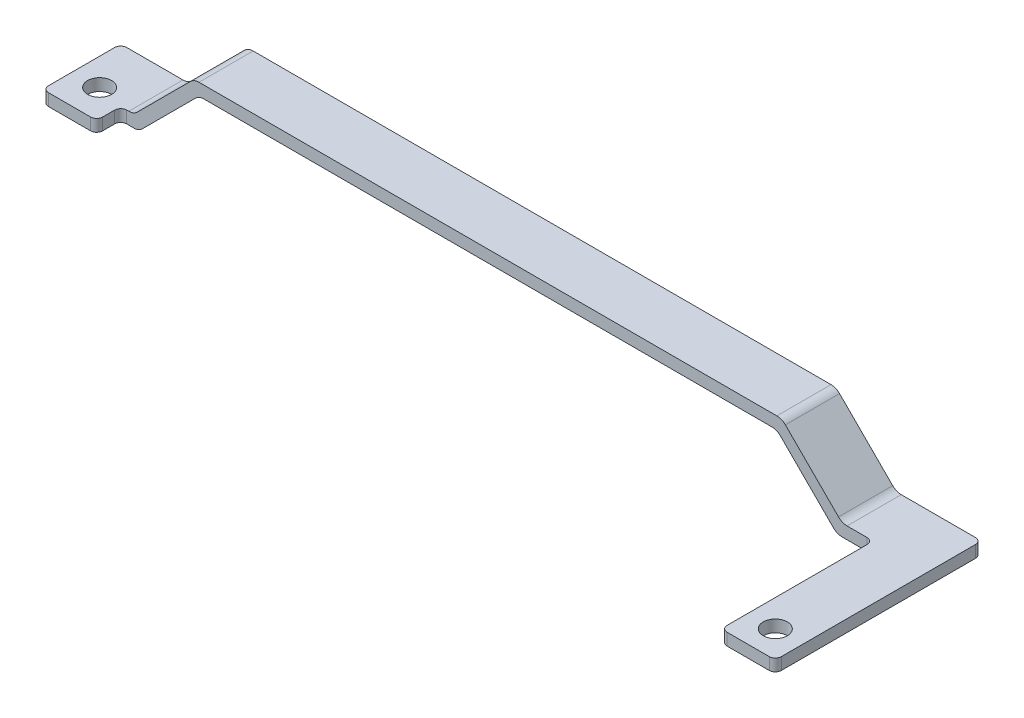
ISO-10303-21;
HEADER;
FILE_DESCRIPTION(('STEP AP214'),'2;1');
FILE_NAME('part.step','',(''),(''),'','','');
FILE_SCHEMA(('AUTOMOTIVE_DESIGN { 1 0 10303 214 1 1 1 1 }'));
ENDSEC;
DATA;
#1=APPLICATION_CONTEXT('core data for automotive mechanical design processes');
#2=APPLICATION_PROTOCOL_DEFINITION('international standard','automotive_design',2000,#1);
#3=PRODUCT_CONTEXT('',#1,'mechanical');
#4=PRODUCT('Part','Part','',(#3));
#5=PRODUCT_RELATED_PRODUCT_CATEGORY('part','',(#4));
#6=PRODUCT_DEFINITION_FORMATION('','',#4);
#7=PRODUCT_DEFINITION_CONTEXT('part definition',#1,'design');
#8=PRODUCT_DEFINITION('design','',#6,#7);
#9=PRODUCT_DEFINITION_SHAPE('','',#8);
#10=(LENGTH_UNIT() NAMED_UNIT(*) SI_UNIT(.MILLI.,.METRE.));
#11=(NAMED_UNIT(*) PLANE_ANGLE_UNIT() SI_UNIT($,.RADIAN.));
#12=(NAMED_UNIT(*) SI_UNIT($,.STERADIAN.) SOLID_ANGLE_UNIT());
#13=UNCERTAINTY_MEASURE_WITH_UNIT(LENGTH_MEASURE(1.E-05),#10,'distance_accuracy_value','');
#14=(GEOMETRIC_REPRESENTATION_CONTEXT(3) GLOBAL_UNCERTAINTY_ASSIGNED_CONTEXT((#13)) GLOBAL_UNIT_ASSIGNED_CONTEXT((#10,
#11,#12)) REPRESENTATION_CONTEXT('',''));
#15=CARTESIAN_POINT('',(0.,0.,0.));
#16=DIRECTION('',(0.,0.,1.));
#17=DIRECTION('',(1.,0.,0.));
#18=AXIS2_PLACEMENT_3D('',#15,#16,#17);
#19=CARTESIAN_POINT('',(5.5,0.,-19.76));
#20=DIRECTION('',(0.,1.,0.));
#21=DIRECTION('',(0.,0.,1.));
#22=AXIS2_PLACEMENT_3D('',#19,#20,#21);
#23=PLANE('',#22);
#24=CARTESIAN_POINT('',(0.,0.,-21.76));
#25=DIRECTION('',(0.,1.,0.));
#26=DIRECTION('',(0.,0.,1.));
#27=AXIS2_PLACEMENT_3D('',#24,#25,#26);
#28=CIRCLE('',#27,2.);
#29=CARTESIAN_POINT('',(0.,0.,-19.76));
#30=VERTEX_POINT('',#29);
#31=EDGE_CURVE('E437',#30,#30,#28,.T.);
#32=ORIENTED_EDGE('',*,*,#31,.T.);
#33=EDGE_LOOP('',(#32));
#34=FACE_BOUND('',#33,.T.);
#35=DIRECTION('',(-1.,0.,0.));
#36=VECTOR('',#35,1.);
#37=CARTESIAN_POINT('',(137.5,0.,-29.76));
#38=LINE('',#37,#36);
#39=CARTESIAN_POINT('',(6.6715728752538,0.,-29.76));
#40=VERTEX_POINT('',#39);
#41=CARTESIAN_POINT('',(-3.5,0.,-29.76));
#42=VERTEX_POINT('',#41);
#43=EDGE_CURVE('E479',#40,#42,#38,.T.);
#44=ORIENTED_EDGE('',*,*,#43,.F.);
#45=DIRECTION('',(0.,0.,1.));
#46=VECTOR('',#45,1.);
#47=CARTESIAN_POINT('',(6.67157287525381,0.,-19.76));
#48=LINE('',#47,#46);
#49=CARTESIAN_POINT('',(6.67157287525381,0.,-20.76));
#50=VERTEX_POINT('',#49);
#51=EDGE_CURVE('E348',#40,#50,#48,.T.);
#52=ORIENTED_EDGE('',*,*,#51,.T.);
#53=DIRECTION('',(1.,0.,0.));
#54=VECTOR('',#53,1.);
#55=CARTESIAN_POINT('',(5.5,0.,-20.76));
#56=LINE('',#55,#54);
#57=CARTESIAN_POINT('',(5.5,0.,-20.76));
#58=VERTEX_POINT('',#57);
#59=EDGE_CURVE('E455',#58,#50,#56,.T.);
#60=ORIENTED_EDGE('',*,*,#59,.F.);
#61=CARTESIAN_POINT('',(5.5,0.,-19.76));
#62=DIRECTION('',(0.,-1.,0.));
#63=DIRECTION('',(0.,0.,1.));
#64=AXIS2_PLACEMENT_3D('',#61,#62,#63);
#65=CIRCLE('',#64,1.);
#66=CARTESIAN_POINT('',(4.5,0.,-19.76));
#67=VERTEX_POINT('',#66);
#68=EDGE_CURVE('E443',#67,#58,#65,.T.);
#69=ORIENTED_EDGE('',*,*,#68,.F.);
#70=DIRECTION('',(0.,0.,-1.));
#71=VECTOR('',#70,1.);
#72=CARTESIAN_POINT('',(4.5,0.,-19.76));
#73=LINE('',#72,#71);
#74=CARTESIAN_POINT('',(4.5,0.,-17.76));
#75=VERTEX_POINT('',#74);
#76=EDGE_CURVE('E448',#75,#67,#73,.T.);
#77=ORIENTED_EDGE('',*,*,#76,.F.);
#78=CARTESIAN_POINT('',(3.5,0.,-17.76));
#79=DIRECTION('',(0.,1.,0.));
#80=DIRECTION('',(0.,0.,-1.));
#81=AXIS2_PLACEMENT_3D('',#78,#79,#80);
#82=CIRCLE('',#81,1.);
#83=CARTESIAN_POINT('',(3.5,0.,-16.76));
#84=VERTEX_POINT('',#83);
#85=EDGE_CURVE('E491',#84,#75,#82,.T.);
#86=ORIENTED_EDGE('',*,*,#85,.F.);
#87=DIRECTION('',(1.,0.,0.));
#88=VECTOR('',#87,1.);
#89=CARTESIAN_POINT('',(3.5,0.,-16.76));
#90=LINE('',#89,#88);
#91=CARTESIAN_POINT('',(-3.5,0.,-16.76));
#92=VERTEX_POINT('',#91);
#93=EDGE_CURVE('E488',#92,#84,#90,.T.);
#94=ORIENTED_EDGE('',*,*,#93,.F.);
#95=CARTESIAN_POINT('',(-3.5,0.,-17.76));
#96=DIRECTION('',(0.,1.,0.));
#97=DIRECTION('',(0.,0.,-1.));
#98=AXIS2_PLACEMENT_3D('',#95,#96,#97);
#99=CIRCLE('',#98,1.);
#100=CARTESIAN_POINT('',(-4.5,0.,-17.76));
#101=VERTEX_POINT('',#100);
#102=EDGE_CURVE('E485',#101,#92,#99,.T.);
#103=ORIENTED_EDGE('',*,*,#102,.F.);
#104=DIRECTION('',(0.,0.,1.));
#105=VECTOR('',#104,1.);
#106=CARTESIAN_POINT('',(-4.5,0.,-28.76));
#107=LINE('',#106,#105);
#108=CARTESIAN_POINT('',(-4.5,0.,-28.76));
#109=VERTEX_POINT('',#108);
#110=EDGE_CURVE('E483',#109,#101,#107,.T.);
#111=ORIENTED_EDGE('',*,*,#110,.F.);
#112=CARTESIAN_POINT('',(-3.5,0.,-28.76));
#113=DIRECTION('',(0.,1.,0.));
#114=DIRECTION('',(0.,0.,-1.));
#115=AXIS2_PLACEMENT_3D('',#112,#113,#114);
#116=CIRCLE('',#115,1.);
#117=EDGE_CURVE('E269',#42,#109,#116,.T.);
#118=ORIENTED_EDGE('',*,*,#117,.F.);
#119=EDGE_LOOP('',(#44,#52,#60,#69,#77,#86,#94,#103,#111,#118));
#120=FACE_BOUND('',#119,.T.);
#121=ADVANCED_FACE('F33',(#34,#120),#23,.F.);
#122=CARTESIAN_POINT('',(5.5,12.,-19.76));
#123=DIRECTION('',(0.,1.,0.));
#124=DIRECTION('',(0.,0.,1.));
#125=AXIS2_PLACEMENT_3D('',#122,#123,#124);
#126=PLANE('',#125);
#127=DIRECTION('',(1.,0.,0.));
#128=VECTOR('',#127,1.);
#129=CARTESIAN_POINT('',(5.5,12.,-20.76));
#130=LINE('',#129,#128);
#131=CARTESIAN_POINT('',(17.5000000000001,12.,-20.76));
#132=VERTEX_POINT('',#131);
#133=CARTESIAN_POINT('',(113.5,12.,-20.76));
#134=VERTEX_POINT('',#133);
#135=EDGE_CURVE('E444',#132,#134,#130,.T.);
#136=ORIENTED_EDGE('',*,*,#135,.T.);
#137=DIRECTION('',(0.,0.,1.));
#138=VECTOR('',#137,1.);
#139=CARTESIAN_POINT('',(113.5,12.,-29.76));
#140=LINE('',#139,#138);
#141=CARTESIAN_POINT('',(113.5,12.,-29.76));
#142=VERTEX_POINT('',#141);
#143=EDGE_CURVE('E336',#134,#142,#140,.F.);
#144=ORIENTED_EDGE('',*,*,#143,.T.);
#145=DIRECTION('',(-1.,0.,0.));
#146=VECTOR('',#145,1.);
#147=CARTESIAN_POINT('',(137.5,12.,-29.76));
#148=LINE('',#147,#146);
#149=CARTESIAN_POINT('',(17.5000000000001,12.,-29.76));
#150=VERTEX_POINT('',#149);
#151=EDGE_CURVE('E447',#142,#150,#148,.T.);
#152=ORIENTED_EDGE('',*,*,#151,.T.);
#153=DIRECTION('',(0.,0.,1.));
#154=VECTOR('',#153,1.);
#155=CARTESIAN_POINT('',(17.5000000000001,12.,-20.76));
#156=LINE('',#155,#154);
#157=EDGE_CURVE('E333',#150,#132,#156,.T.);
#158=ORIENTED_EDGE('',*,*,#157,.T.);
#159=EDGE_LOOP('',(#136,#144,#152,#158));
#160=FACE_BOUND('',#159,.T.);
#161=ADVANCED_FACE('F589',(#160),#126,.T.);
#162=CARTESIAN_POINT('',(124.328427124746,0.,-20.76));
#163=VERTEX_POINT('',#162);
#164=CARTESIAN_POINT('',(128.5,0.,-20.76));
#165=VERTEX_POINT('',#164);
#166=EDGE_CURVE('E454',#163,#165,#56,.T.);
#167=ORIENTED_EDGE('',*,*,#166,.F.);
#168=DIRECTION('',(0.,0.,1.));
#169=VECTOR('',#168,1.);
#170=CARTESIAN_POINT('',(124.328427124746,0.,-19.76));
#171=LINE('',#170,#169);
#172=CARTESIAN_POINT('',(124.328427124746,0.,-29.76));
#173=VERTEX_POINT('',#172);
#174=EDGE_CURVE('E316',#163,#173,#171,.F.);
#175=ORIENTED_EDGE('',*,*,#174,.T.);
#176=CARTESIAN_POINT('',(137.5,0.,-29.76));
#177=VERTEX_POINT('',#176);
#178=EDGE_CURVE('E480',#177,#173,#38,.T.);
#179=ORIENTED_EDGE('',*,*,#178,.F.);
#180=CARTESIAN_POINT('',(137.5,0.,-28.76));
#181=DIRECTION('',(0.,1.,0.));
#182=DIRECTION('',(0.,0.,1.));
#183=AXIS2_PLACEMENT_3D('',#180,#181,#182);
#184=CIRCLE('',#183,1.);
#185=CARTESIAN_POINT('',(138.5,0.,-28.76));
#186=VERTEX_POINT('',#185);
#187=EDGE_CURVE('E476',#186,#177,#184,.T.);
#188=ORIENTED_EDGE('',*,*,#187,.F.);
#189=DIRECTION('',(0.,0.,-1.));
#190=VECTOR('',#189,1.);
#191=CARTESIAN_POINT('',(138.5,0.,3.5));
#192=LINE('',#191,#190);
#193=CARTESIAN_POINT('',(138.5,0.,3.5));
#194=VERTEX_POINT('',#193);
#195=EDGE_CURVE('E473',#194,#186,#192,.T.);
#196=ORIENTED_EDGE('',*,*,#195,.F.);
#197=CARTESIAN_POINT('',(137.5,0.,3.5));
#198=DIRECTION('',(0.,1.,0.));
#199=DIRECTION('',(0.,0.,1.));
#200=AXIS2_PLACEMENT_3D('',#197,#198,#199);
#201=CIRCLE('',#200,1.);
#202=CARTESIAN_POINT('',(137.5,0.,4.5));
#203=VERTEX_POINT('',#202);
#204=EDGE_CURVE('E470',#203,#194,#201,.T.);
#205=ORIENTED_EDGE('',*,*,#204,.F.);
#206=DIRECTION('',(1.,0.,0.));
#207=VECTOR('',#206,1.);
#208=CARTESIAN_POINT('',(130.5,0.,4.5));
#209=LINE('',#208,#207);
#210=CARTESIAN_POINT('',(130.5,0.,4.5));
#211=VERTEX_POINT('',#210);
#212=EDGE_CURVE('E467',#211,#203,#209,.T.);
#213=ORIENTED_EDGE('',*,*,#212,.F.);
#214=CARTESIAN_POINT('',(130.5,0.,3.5));
#215=DIRECTION('',(0.,1.,0.));
#216=DIRECTION('',(0.,0.,1.));
#217=AXIS2_PLACEMENT_3D('',#214,#215,#216);
#218=CIRCLE('',#217,1.);
#219=CARTESIAN_POINT('',(129.5,0.,3.5));
#220=VERTEX_POINT('',#219);
#221=EDGE_CURVE('E464',#220,#211,#218,.T.);
#222=ORIENTED_EDGE('',*,*,#221,.F.);
#223=DIRECTION('',(0.,0.,1.));
#224=VECTOR('',#223,1.);
#225=CARTESIAN_POINT('',(129.5,0.,-19.76));
#226=LINE('',#225,#224);
#227=CARTESIAN_POINT('',(129.5,0.,-19.76));
#228=VERTEX_POINT('',#227);
#229=EDGE_CURVE('E461',#228,#220,#226,.T.);
#230=ORIENTED_EDGE('',*,*,#229,.F.);
#231=CARTESIAN_POINT('',(128.5,0.,-19.76));
#232=DIRECTION('',(0.,-1.,0.));
#233=DIRECTION('',(0.,0.,-1.));
#234=AXIS2_PLACEMENT_3D('',#231,#232,#233);
#235=CIRCLE('',#234,1.00000000000001);
#236=EDGE_CURVE('E458',#165,#228,#235,.T.);
#237=ORIENTED_EDGE('',*,*,#236,.F.);
#238=EDGE_LOOP('',(#167,#175,#179,#188,#196,#205,#213,#222,#230,#237));
#239=FACE_BOUND('',#238,.T.);
#240=CARTESIAN_POINT('',(134.,0.,0.));
#241=DIRECTION('',(0.,1.,0.));
#242=DIRECTION('',(0.,0.,1.));
#243=AXIS2_PLACEMENT_3D('',#240,#241,#242);
#244=CIRCLE('',#243,2.);
#245=CARTESIAN_POINT('',(134.,0.,2.));
#246=VERTEX_POINT('',#245);
#247=EDGE_CURVE('E440',#246,#246,#244,.T.);
#248=ORIENTED_EDGE('',*,*,#247,.T.);
#249=EDGE_LOOP('',(#248));
#250=FACE_BOUND('',#249,.T.);
#251=ADVANCED_FACE('F563',(#239,#250),#23,.F.);
#252=CARTESIAN_POINT('',(5.5,12.,-19.76));
#253=DIRECTION('',(0.,-1.,0.));
#254=DIRECTION('',(0.,0.,-1.));
#255=AXIS2_PLACEMENT_3D('',#252,#253,#254);
#256=CYLINDRICAL_SURFACE('',#255,1.);
#257=DIRECTION('',(0.,-1.,0.));
#258=VECTOR('',#257,1.);
#259=CARTESIAN_POINT('',(5.5,12.,-20.76));
#260=LINE('',#259,#258);
#261=CARTESIAN_POINT('',(5.5,2.,-20.76));
#262=VERTEX_POINT('',#261);
#263=EDGE_CURVE('E295',#262,#58,#260,.T.);
#264=ORIENTED_EDGE('',*,*,#263,.F.);
#265=CARTESIAN_POINT('',(5.5,2.,-19.76));
#266=DIRECTION('',(0.,-1.,0.));
#267=DIRECTION('',(0.,0.,-1.));
#268=AXIS2_PLACEMENT_3D('',#265,#266,#267);
#269=CIRCLE('',#268,1.);
#270=CARTESIAN_POINT('',(4.5,2.,-19.76));
#271=VERTEX_POINT('',#270);
#272=EDGE_CURVE('E379',#262,#271,#269,.F.);
#273=ORIENTED_EDGE('',*,*,#272,.T.);
#274=DIRECTION('',(0.,-1.,0.));
#275=VECTOR('',#274,1.);
#276=CARTESIAN_POINT('',(4.5,12.,-19.76));
#277=LINE('',#276,#275);
#278=EDGE_CURVE('E451',#271,#67,#277,.T.);
#279=ORIENTED_EDGE('',*,*,#278,.T.);
#280=ORIENTED_EDGE('',*,*,#68,.T.);
#281=EDGE_LOOP('',(#264,#273,#279,#280));
#282=FACE_BOUND('',#281,.T.);
#283=ADVANCED_FACE('F520',(#282),#256,.F.);
#284=CARTESIAN_POINT('',(5.5,12.,-20.76));
#285=DIRECTION('',(0.,0.,-1.));
#286=DIRECTION('',(-1.,0.,0.));
#287=AXIS2_PLACEMENT_3D('',#284,#285,#286);
#288=PLANE('',#287);
#289=DIRECTION('',(0.707106781186551,-0.707106781186544,0.));
#290=VECTOR('',#289,1.);
#291=CARTESIAN_POINT('',(58.4999999999994,64.9999999999999,-20.76));
#292=LINE('',#291,#290);
#293=CARTESIAN_POINT('',(114.085786437627,9.4142135623731,-20.76));
#294=VERTEX_POINT('',#293);
#295=CARTESIAN_POINT('',(122.914213562373,0.585786437626898,-20.76));
#296=VERTEX_POINT('',#295);
#297=EDGE_CURVE('E429',#294,#296,#292,.T.);
#298=ORIENTED_EDGE('',*,*,#297,.T.);
#299=CARTESIAN_POINT('',(124.328427124746,2.,-20.76));
#300=DIRECTION('',(0.,0.,-1.));
#301=DIRECTION('',(-1.,0.,0.));
#302=AXIS2_PLACEMENT_3D('',#299,#300,#301);
#303=CIRCLE('',#302,2.);
#304=EDGE_CURVE('E314',#296,#163,#303,.F.);
#305=ORIENTED_EDGE('',*,*,#304,.T.);
#306=ORIENTED_EDGE('',*,*,#166,.T.);
#307=DIRECTION('',(0.,-1.,0.));
#308=VECTOR('',#307,1.);
#309=CARTESIAN_POINT('',(128.5,12.,-20.76));
#310=LINE('',#309,#308);
#311=CARTESIAN_POINT('',(128.5,2.,-20.76));
#312=VERTEX_POINT('',#311);
#313=EDGE_CURVE('E292',#312,#165,#310,.T.);
#314=ORIENTED_EDGE('',*,*,#313,.F.);
#315=DIRECTION('',(-1.,0.,0.));
#316=VECTOR('',#315,1.);
#317=CARTESIAN_POINT('',(5.5,2.,-20.76));
#318=LINE('',#317,#316);
#319=CARTESIAN_POINT('',(125.156854249492,2.,-20.76));
#320=VERTEX_POINT('',#319);
#321=EDGE_CURVE('E422',#312,#320,#318,.T.);
#322=ORIENTED_EDGE('',*,*,#321,.T.);
#323=CARTESIAN_POINT('',(125.156854249492,4.,-20.76));
#324=DIRECTION('',(0.,0.,-1.));
#325=DIRECTION('',(-1.,0.,0.));
#326=AXIS2_PLACEMENT_3D('',#323,#324,#325);
#327=CIRCLE('',#326,2.);
#328=CARTESIAN_POINT('',(123.742640687119,2.5857864376269,-20.76));
#329=VERTEX_POINT('',#328);
#330=EDGE_CURVE('E358',#320,#329,#327,.T.);
#331=ORIENTED_EDGE('',*,*,#330,.T.);
#332=DIRECTION('',(-0.707106781186552,0.707106781186543,0.));
#333=VECTOR('',#332,1.);
#334=CARTESIAN_POINT('',(59.9142135623724,66.414213562373,-20.76));
#335=LINE('',#334,#333);
#336=CARTESIAN_POINT('',(114.914213562373,11.4142135623731,-20.76));
#337=VERTEX_POINT('',#336);
#338=EDGE_CURVE('E426',#329,#337,#335,.T.);
#339=ORIENTED_EDGE('',*,*,#338,.T.);
#340=CARTESIAN_POINT('',(113.5,10.,-20.76));
#341=DIRECTION('',(0.,0.,-1.));
#342=DIRECTION('',(-1.,0.,0.));
#343=AXIS2_PLACEMENT_3D('',#340,#341,#342);
#344=CIRCLE('',#343,2.);
#345=EDGE_CURVE('E312',#337,#134,#344,.F.);
#346=ORIENTED_EDGE('',*,*,#345,.T.);
#347=ORIENTED_EDGE('',*,*,#135,.F.);
#348=CARTESIAN_POINT('',(17.5000000000001,10.,-20.76));
#349=DIRECTION('',(0.,0.,-1.));
#350=DIRECTION('',(-1.,0.,0.));
#351=AXIS2_PLACEMENT_3D('',#348,#349,#350);
#352=CIRCLE('',#351,2.);
#353=CARTESIAN_POINT('',(16.085786437627,11.4142135623731,-20.76));
#354=VERTEX_POINT('',#353);
#355=EDGE_CURVE('E308',#132,#354,#352,.F.);
#356=ORIENTED_EDGE('',*,*,#355,.T.);
#357=DIRECTION('',(-0.707106781186551,-0.707106781186544,0.));
#358=VECTOR('',#357,1.);
#359=CARTESIAN_POINT('',(11.0857864376269,6.41421356237304,-20.76));
#360=LINE('',#359,#358);
#361=CARTESIAN_POINT('',(7.25735931288072,2.5857864376269,-20.76));
#362=VERTEX_POINT('',#361);
#363=EDGE_CURVE('E374',#354,#362,#360,.T.);
#364=ORIENTED_EDGE('',*,*,#363,.T.);
#365=CARTESIAN_POINT('',(5.84314575050763,4.,-20.76));
#366=DIRECTION('',(0.,0.,-1.));
#367=DIRECTION('',(-1.,0.,0.));
#368=AXIS2_PLACEMENT_3D('',#365,#366,#367);
#369=CIRCLE('',#368,2.);
#370=CARTESIAN_POINT('',(5.84314575050763,2.,-20.76));
#371=VERTEX_POINT('',#370);
#372=EDGE_CURVE('E41',#362,#371,#369,.T.);
#373=ORIENTED_EDGE('',*,*,#372,.T.);
#374=DIRECTION('',(-1.,0.,0.));
#375=VECTOR('',#374,1.);
#376=CARTESIAN_POINT('',(5.5,2.,-20.76));
#377=LINE('',#376,#375);
#378=EDGE_CURVE('E255',#371,#262,#377,.T.);
#379=ORIENTED_EDGE('',*,*,#378,.T.);
#380=ORIENTED_EDGE('',*,*,#263,.T.);
#381=ORIENTED_EDGE('',*,*,#59,.T.);
#382=CARTESIAN_POINT('',(6.67157287525381,2.,-20.76));
#383=DIRECTION('',(0.,0.,-1.));
#384=DIRECTION('',(-1.,0.,0.));
#385=AXIS2_PLACEMENT_3D('',#382,#383,#384);
#386=CIRCLE('',#385,2.);
#387=CARTESIAN_POINT('',(8.0857864376269,0.585786437626899,-20.76));
#388=VERTEX_POINT('',#387);
#389=EDGE_CURVE('E310',#50,#388,#386,.F.);
#390=ORIENTED_EDGE('',*,*,#389,.T.);
#391=DIRECTION('',(0.707106781186551,0.707106781186544,0.));
#392=VECTOR('',#391,1.);
#393=CARTESIAN_POINT('',(12.5,4.99999999999994,-20.76));
#394=LINE('',#393,#392);
#395=CARTESIAN_POINT('',(16.9142135623732,9.41421356237309,-20.76));
#396=VERTEX_POINT('',#395);
#397=EDGE_CURVE('E434',#388,#396,#394,.T.);
#398=ORIENTED_EDGE('',*,*,#397,.T.);
#399=CARTESIAN_POINT('',(18.3284271247463,7.99999999999999,-20.76));
#400=DIRECTION('',(0.,0.,-1.));
#401=DIRECTION('',(-1.,0.,0.));
#402=AXIS2_PLACEMENT_3D('',#399,#400,#401);
#403=CIRCLE('',#402,2.);
#404=CARTESIAN_POINT('',(18.3284271247463,9.99999999999999,-20.76));
#405=VERTEX_POINT('',#404);
#406=EDGE_CURVE('E365',#396,#405,#403,.T.);
#407=ORIENTED_EDGE('',*,*,#406,.T.);
#408=DIRECTION('',(1.,0.,0.));
#409=VECTOR('',#408,1.);
#410=CARTESIAN_POINT('',(5.5,9.99999999999999,-20.76));
#411=LINE('',#410,#409);
#412=CARTESIAN_POINT('',(112.671572875254,10.,-20.76));
#413=VERTEX_POINT('',#412);
#414=EDGE_CURVE('E431',#405,#413,#411,.T.);
#415=ORIENTED_EDGE('',*,*,#414,.T.);
#416=CARTESIAN_POINT('',(112.671572875254,8.,-20.76));
#417=DIRECTION('',(0.,0.,-1.));
#418=DIRECTION('',(-1.,0.,0.));
#419=AXIS2_PLACEMENT_3D('',#416,#417,#418);
#420=CIRCLE('',#419,2.);
#421=EDGE_CURVE('E361',#413,#294,#420,.T.);
#422=ORIENTED_EDGE('',*,*,#421,.T.);
#423=EDGE_LOOP('',(#298,#305,#306,#314,#322,#331,#339,#346,#347,#356,#364,#373,#379,#380,#381,
#390,#398,#407,#415,#422));
#424=FACE_BOUND('',#423,.T.);
#425=ADVANCED_FACE('F371',(#424),#288,.F.);
#426=CARTESIAN_POINT('',(128.5,12.,-19.76));
#427=DIRECTION('',(0.,-1.,0.));
#428=DIRECTION('',(0.,0.,-1.));
#429=AXIS2_PLACEMENT_3D('',#426,#427,#428);
#430=CYLINDRICAL_SURFACE('',#429,1.00000000000001);
#431=DIRECTION('',(0.,-1.,0.));
#432=VECTOR('',#431,1.);
#433=CARTESIAN_POINT('',(129.5,12.,-19.76));
#434=LINE('',#433,#432);
#435=CARTESIAN_POINT('',(129.5,2.,-19.76));
#436=VERTEX_POINT('',#435);
#437=EDGE_CURVE('E290',#436,#228,#434,.T.);
#438=ORIENTED_EDGE('',*,*,#437,.F.);
#439=CARTESIAN_POINT('',(128.5,2.,-19.76));
#440=DIRECTION('',(0.,-1.,0.));
#441=DIRECTION('',(0.,0.,-1.));
#442=AXIS2_PLACEMENT_3D('',#439,#440,#441);
#443=CIRCLE('',#442,1.00000000000001);
#444=EDGE_CURVE('E419',#436,#312,#443,.F.);
#445=ORIENTED_EDGE('',*,*,#444,.T.);
#446=ORIENTED_EDGE('',*,*,#313,.T.);
#447=ORIENTED_EDGE('',*,*,#236,.T.);
#448=EDGE_LOOP('',(#438,#445,#446,#447));
#449=FACE_BOUND('',#448,.T.);
#450=ADVANCED_FACE('F570',(#449),#430,.F.);
#451=CARTESIAN_POINT('',(129.5,12.,-19.76));
#452=DIRECTION('',(1.,0.,0.));
#453=DIRECTION('',(0.,0.,-1.));
#454=AXIS2_PLACEMENT_3D('',#451,#452,#453);
#455=PLANE('',#454);
#456=DIRECTION('',(0.,-1.,0.));
#457=VECTOR('',#456,1.);
#458=CARTESIAN_POINT('',(129.5,12.,3.5));
#459=LINE('',#458,#457);
#460=CARTESIAN_POINT('',(129.5,2.,3.5));
#461=VERTEX_POINT('',#460);
#462=EDGE_CURVE('E288',#461,#220,#459,.T.);
#463=ORIENTED_EDGE('',*,*,#462,.F.);
#464=DIRECTION('',(0.,0.,-1.));
#465=VECTOR('',#464,1.);
#466=CARTESIAN_POINT('',(129.5,2.,-19.76));
#467=LINE('',#466,#465);
#468=EDGE_CURVE('E416',#461,#436,#467,.T.);
#469=ORIENTED_EDGE('',*,*,#468,.T.);
#470=ORIENTED_EDGE('',*,*,#437,.T.);
#471=ORIENTED_EDGE('',*,*,#229,.T.);
#472=EDGE_LOOP('',(#463,#469,#470,#471));
#473=FACE_BOUND('',#472,.T.);
#474=ADVANCED_FACE('F610',(#473),#455,.F.);
#475=CARTESIAN_POINT('',(130.5,12.,3.5));
#476=DIRECTION('',(0.,-1.,0.));
#477=DIRECTION('',(0.,0.,-1.));
#478=AXIS2_PLACEMENT_3D('',#475,#476,#477);
#479=CYLINDRICAL_SURFACE('',#478,1.);
#480=DIRECTION('',(0.,-1.,0.));
#481=VECTOR('',#480,1.);
#482=CARTESIAN_POINT('',(130.5,12.,4.5));
#483=LINE('',#482,#481);
#484=CARTESIAN_POINT('',(130.5,2.,4.50000000000002));
#485=VERTEX_POINT('',#484);
#486=EDGE_CURVE('E286',#485,#211,#483,.T.);
#487=ORIENTED_EDGE('',*,*,#486,.F.);
#488=CARTESIAN_POINT('',(130.5,2.,3.5));
#489=DIRECTION('',(0.,-1.,0.));
#490=DIRECTION('',(0.,0.,-1.));
#491=AXIS2_PLACEMENT_3D('',#488,#489,#490);
#492=CIRCLE('',#491,1.);
#493=EDGE_CURVE('E413',#485,#461,#492,.T.);
#494=ORIENTED_EDGE('',*,*,#493,.T.);
#495=ORIENTED_EDGE('',*,*,#462,.T.);
#496=ORIENTED_EDGE('',*,*,#221,.T.);
#497=EDGE_LOOP('',(#487,#494,#495,#496));
#498=FACE_BOUND('',#497,.T.);
#499=ADVANCED_FACE('F613',(#498),#479,.T.);
#500=CARTESIAN_POINT('',(130.5,12.,4.5));
#501=DIRECTION('',(0.,0.,-1.));
#502=DIRECTION('',(-1.,0.,0.));
#503=AXIS2_PLACEMENT_3D('',#500,#501,#502);
#504=PLANE('',#503);
#505=DIRECTION('',(0.,-1.,0.));
#506=VECTOR('',#505,1.);
#507=CARTESIAN_POINT('',(137.5,12.,4.5));
#508=LINE('',#507,#506);
#509=CARTESIAN_POINT('',(137.5,2.,4.50000000000002));
#510=VERTEX_POINT('',#509);
#511=EDGE_CURVE('E284',#510,#203,#508,.T.);
#512=ORIENTED_EDGE('',*,*,#511,.F.);
#513=DIRECTION('',(1.,0.,0.));
#514=VECTOR('',#513,1.);
#515=CARTESIAN_POINT('',(124.328427124746,2.,4.50000000000002));
#516=LINE('',#515,#514);
#517=EDGE_CURVE('E757',#485,#510,#516,.T.);
#518=ORIENTED_EDGE('',*,*,#517,.F.);
#519=ORIENTED_EDGE('',*,*,#486,.T.);
#520=ORIENTED_EDGE('',*,*,#212,.T.);
#521=EDGE_LOOP('',(#512,#518,#519,#520));
#522=FACE_BOUND('',#521,.T.);
#523=ADVANCED_FACE('F617',(#522),#504,.F.);
#524=CARTESIAN_POINT('',(137.5,12.,3.5));
#525=DIRECTION('',(0.,-1.,0.));
#526=DIRECTION('',(0.,0.,-1.));
#527=AXIS2_PLACEMENT_3D('',#524,#525,#526);
#528=CYLINDRICAL_SURFACE('',#527,1.);
#529=DIRECTION('',(0.,-1.,0.));
#530=VECTOR('',#529,1.);
#531=CARTESIAN_POINT('',(138.5,12.,3.5));
#532=LINE('',#531,#530);
#533=CARTESIAN_POINT('',(138.5,2.,3.5));
#534=VERTEX_POINT('',#533);
#535=EDGE_CURVE('E282',#534,#194,#532,.T.);
#536=ORIENTED_EDGE('',*,*,#535,.F.);
#537=CARTESIAN_POINT('',(137.5,2.,3.5));
#538=DIRECTION('',(0.,-1.,0.));
#539=DIRECTION('',(0.,0.,-1.));
#540=AXIS2_PLACEMENT_3D('',#537,#538,#539);
#541=CIRCLE('',#540,1.);
#542=EDGE_CURVE('E410',#534,#510,#541,.T.);
#543=ORIENTED_EDGE('',*,*,#542,.T.);
#544=ORIENTED_EDGE('',*,*,#511,.T.);
#545=ORIENTED_EDGE('',*,*,#204,.T.);
#546=EDGE_LOOP('',(#536,#543,#544,#545));
#547=FACE_BOUND('',#546,.T.);
#548=ADVANCED_FACE('F621',(#547),#528,.T.);
#549=CARTESIAN_POINT('',(138.5,12.,3.5));
#550=DIRECTION('',(-1.,0.,0.));
#551=DIRECTION('',(0.,0.,1.));
#552=AXIS2_PLACEMENT_3D('',#549,#550,#551);
#553=PLANE('',#552);
#554=DIRECTION('',(0.,-1.,0.));
#555=VECTOR('',#554,1.);
#556=CARTESIAN_POINT('',(138.5,12.,-28.76));
#557=LINE('',#556,#555);
#558=CARTESIAN_POINT('',(138.5,2.,-28.76));
#559=VERTEX_POINT('',#558);
#560=EDGE_CURVE('E280',#559,#186,#557,.T.);
#561=ORIENTED_EDGE('',*,*,#560,.F.);
#562=DIRECTION('',(0.,0.,1.));
#563=VECTOR('',#562,1.);
#564=CARTESIAN_POINT('',(138.5,2.,-29.76));
#565=LINE('',#564,#563);
#566=EDGE_CURVE('E759',#559,#534,#565,.T.);
#567=ORIENTED_EDGE('',*,*,#566,.T.);
#568=ORIENTED_EDGE('',*,*,#535,.T.);
#569=ORIENTED_EDGE('',*,*,#195,.T.);
#570=EDGE_LOOP('',(#561,#567,#568,#569));
#571=FACE_BOUND('',#570,.T.);
#572=ADVANCED_FACE('F625',(#571),#553,.F.);
#573=CARTESIAN_POINT('',(137.5,12.,-28.76));
#574=DIRECTION('',(0.,-1.,0.));
#575=DIRECTION('',(0.,0.,-1.));
#576=AXIS2_PLACEMENT_3D('',#573,#574,#575);
#577=CYLINDRICAL_SURFACE('',#576,1.);
#578=DIRECTION('',(0.,-1.,0.));
#579=VECTOR('',#578,1.);
#580=CARTESIAN_POINT('',(137.5,12.,-29.76));
#581=LINE('',#580,#579);
#582=CARTESIAN_POINT('',(137.5,2.,-29.76));
#583=VERTEX_POINT('',#582);
#584=EDGE_CURVE('E273',#583,#177,#581,.T.);
#585=ORIENTED_EDGE('',*,*,#584,.F.);
#586=CARTESIAN_POINT('',(137.5,2.,-28.76));
#587=DIRECTION('',(0.,-1.,0.));
#588=DIRECTION('',(0.,0.,-1.));
#589=AXIS2_PLACEMENT_3D('',#586,#587,#588);
#590=CIRCLE('',#589,1.);
#591=EDGE_CURVE('E303',#583,#559,#590,.T.);
#592=ORIENTED_EDGE('',*,*,#591,.T.);
#593=ORIENTED_EDGE('',*,*,#560,.T.);
#594=ORIENTED_EDGE('',*,*,#187,.T.);
#595=EDGE_LOOP('',(#585,#592,#593,#594));
#596=FACE_BOUND('',#595,.T.);
#597=ADVANCED_FACE('F629',(#596),#577,.T.);
#598=CARTESIAN_POINT('',(137.5,12.,-29.76));
#599=DIRECTION('',(0.,0.,1.));
#600=DIRECTION('',(1.,0.,0.));
#601=AXIS2_PLACEMENT_3D('',#598,#599,#600);
#602=PLANE('',#601);
#603=ORIENTED_EDGE('',*,*,#178,.T.);
#604=CARTESIAN_POINT('',(124.328427124746,2.,-29.76));
#605=DIRECTION('',(0.,0.,1.));
#606=DIRECTION('',(1.,0.,0.));
#607=AXIS2_PLACEMENT_3D('',#604,#605,#606);
#608=CIRCLE('',#607,2.);
#609=CARTESIAN_POINT('',(122.914213562373,0.585786437626892,-29.76));
#610=VERTEX_POINT('',#609);
#611=EDGE_CURVE('E324',#173,#610,#608,.F.);
#612=ORIENTED_EDGE('',*,*,#611,.T.);
#613=DIRECTION('',(-0.707106781186551,0.707106781186544,0.));
#614=VECTOR('',#613,1.);
#615=CARTESIAN_POINT('',(123.5,0.,-29.76));
#616=LINE('',#615,#614);
#617=CARTESIAN_POINT('',(114.085786437627,9.41421356237311,-29.76));
#618=VERTEX_POINT('',#617);
#619=EDGE_CURVE('E554',#610,#618,#616,.T.);
#620=ORIENTED_EDGE('',*,*,#619,.T.);
#621=CARTESIAN_POINT('',(112.671572875254,8.,-29.76));
#622=DIRECTION('',(0.,0.,1.));
#623=DIRECTION('',(1.,0.,0.));
#624=AXIS2_PLACEMENT_3D('',#621,#622,#623);
#625=CIRCLE('',#624,2.);
#626=CARTESIAN_POINT('',(112.671572875254,10.,-29.76));
#627=VERTEX_POINT('',#626);
#628=EDGE_CURVE('E363',#618,#627,#625,.T.);
#629=ORIENTED_EDGE('',*,*,#628,.T.);
#630=DIRECTION('',(-1.,0.,0.));
#631=VECTOR('',#630,1.);
#632=CARTESIAN_POINT('',(113.5,10.,-29.76));
#633=LINE('',#632,#631);
#634=CARTESIAN_POINT('',(18.3284271247463,9.99999999999999,-29.76));
#635=VERTEX_POINT('',#634);
#636=EDGE_CURVE('E393',#627,#635,#633,.T.);
#637=ORIENTED_EDGE('',*,*,#636,.T.);
#638=CARTESIAN_POINT('',(18.3284271247463,7.99999999999999,-29.76));
#639=DIRECTION('',(0.,0.,1.));
#640=DIRECTION('',(1.,0.,0.));
#641=AXIS2_PLACEMENT_3D('',#638,#639,#640);
#642=CIRCLE('',#641,2.);
#643=CARTESIAN_POINT('',(16.9142135623732,9.41421356237309,-29.76));
#644=VERTEX_POINT('',#643);
#645=EDGE_CURVE('E367',#635,#644,#642,.T.);
#646=ORIENTED_EDGE('',*,*,#645,.T.);
#647=DIRECTION('',(-0.707106781186551,-0.707106781186544,0.));
#648=VECTOR('',#647,1.);
#649=CARTESIAN_POINT('',(17.5000000000001,9.99999999999999,-29.76));
#650=LINE('',#649,#648);
#651=CARTESIAN_POINT('',(8.0857864376269,0.5857864376269,-29.76));
#652=VERTEX_POINT('',#651);
#653=EDGE_CURVE('E533',#644,#652,#650,.T.);
#654=ORIENTED_EDGE('',*,*,#653,.T.);
#655=CARTESIAN_POINT('',(6.67157287525381,2.,-29.76));
#656=DIRECTION('',(0.,0.,1.));
#657=DIRECTION('',(1.,0.,0.));
#658=AXIS2_PLACEMENT_3D('',#655,#656,#657);
#659=CIRCLE('',#658,2.);
#660=EDGE_CURVE('E320',#652,#40,#659,.F.);
#661=ORIENTED_EDGE('',*,*,#660,.T.);
#662=ORIENTED_EDGE('',*,*,#43,.T.);
#663=DIRECTION('',(0.,-1.,0.));
#664=VECTOR('',#663,1.);
#665=CARTESIAN_POINT('',(-3.5,12.,-29.76));
#666=LINE('',#665,#664);
#667=CARTESIAN_POINT('',(-3.5,2.,-29.76));
#668=VERTEX_POINT('',#667);
#669=EDGE_CURVE('E271',#668,#42,#666,.T.);
#670=ORIENTED_EDGE('',*,*,#669,.F.);
#671=DIRECTION('',(1.,0.,0.));
#672=VECTOR('',#671,1.);
#673=CARTESIAN_POINT('',(-4.5,2.,-29.76));
#674=LINE('',#673,#672);
#675=CARTESIAN_POINT('',(5.84314575050763,2.,-29.76));
#676=VERTEX_POINT('',#675);
#677=EDGE_CURVE('E249',#668,#676,#674,.T.);
#678=ORIENTED_EDGE('',*,*,#677,.T.);
#679=CARTESIAN_POINT('',(5.84314575050763,4.,-29.76));
#680=DIRECTION('',(0.,0.,1.));
#681=DIRECTION('',(1.,0.,0.));
#682=AXIS2_PLACEMENT_3D('',#679,#680,#681);
#683=CIRCLE('',#682,2.);
#684=CARTESIAN_POINT('',(7.25735931288072,2.5857864376269,-29.76));
#685=VERTEX_POINT('',#684);
#686=EDGE_CURVE('E11',#676,#685,#683,.T.);
#687=ORIENTED_EDGE('',*,*,#686,.T.);
#688=DIRECTION('',(0.707106781186551,0.707106781186544,0.));
#689=VECTOR('',#688,1.);
#690=CARTESIAN_POINT('',(6.67157287525382,2.,-29.76));
#691=LINE('',#690,#689);
#692=CARTESIAN_POINT('',(16.085786437627,11.4142135623731,-29.76));
#693=VERTEX_POINT('',#692);
#694=EDGE_CURVE('E265',#685,#693,#691,.T.);
#695=ORIENTED_EDGE('',*,*,#694,.T.);
#696=CARTESIAN_POINT('',(17.5000000000001,10.,-29.76));
#697=DIRECTION('',(0.,0.,1.));
#698=DIRECTION('',(1.,0.,0.));
#699=AXIS2_PLACEMENT_3D('',#696,#697,#698);
#700=CIRCLE('',#699,2.);
#701=EDGE_CURVE('E318',#693,#150,#700,.F.);
#702=ORIENTED_EDGE('',*,*,#701,.T.);
#703=ORIENTED_EDGE('',*,*,#151,.F.);
#704=CARTESIAN_POINT('',(113.5,10.,-29.76));
#705=DIRECTION('',(0.,0.,1.));
#706=DIRECTION('',(1.,0.,0.));
#707=AXIS2_PLACEMENT_3D('',#704,#705,#706);
#708=CIRCLE('',#707,2.);
#709=CARTESIAN_POINT('',(114.914213562373,11.4142135623731,-29.76));
#710=VERTEX_POINT('',#709);
#711=EDGE_CURVE('E322',#142,#710,#708,.F.);
#712=ORIENTED_EDGE('',*,*,#711,.T.);
#713=DIRECTION('',(0.707106781186552,-0.707106781186543,0.));
#714=VECTOR('',#713,1.);
#715=CARTESIAN_POINT('',(114.328427124746,12.,-29.76));
#716=LINE('',#715,#714);
#717=CARTESIAN_POINT('',(123.742640687119,2.5857864376269,-29.76));
#718=VERTEX_POINT('',#717);
#719=EDGE_CURVE('E756',#710,#718,#716,.T.);
#720=ORIENTED_EDGE('',*,*,#719,.T.);
#721=CARTESIAN_POINT('',(125.156854249492,4.,-29.76));
#722=DIRECTION('',(0.,0.,1.));
#723=DIRECTION('',(1.,0.,0.));
#724=AXIS2_PLACEMENT_3D('',#721,#722,#723);
#725=CIRCLE('',#724,2.);
#726=CARTESIAN_POINT('',(125.156854249492,2.,-29.76));
#727=VERTEX_POINT('',#726);
#728=EDGE_CURVE('E48',#718,#727,#725,.T.);
#729=ORIENTED_EDGE('',*,*,#728,.T.);
#730=DIRECTION('',(1.,0.,0.));
#731=VECTOR('',#730,1.);
#732=CARTESIAN_POINT('',(124.328427124746,2.,-29.76));
#733=LINE('',#732,#731);
#734=EDGE_CURVE('E575',#727,#583,#733,.T.);
#735=ORIENTED_EDGE('',*,*,#734,.T.);
#736=ORIENTED_EDGE('',*,*,#584,.T.);
#737=EDGE_LOOP('',(#603,#612,#620,#629,#637,#646,#654,#661,#662,#670,#678,#687,#695,#702,#703,
#712,#720,#729,#735,#736));
#738=FACE_BOUND('',#737,.T.);
#739=ADVANCED_FACE('F387',(#738),#602,.F.);
#740=CARTESIAN_POINT('',(-3.5,12.,-28.76));
#741=DIRECTION('',(0.,-1.,0.));
#742=DIRECTION('',(0.,0.,-1.));
#743=AXIS2_PLACEMENT_3D('',#740,#741,#742);
#744=CYLINDRICAL_SURFACE('',#743,1.);
#745=DIRECTION('',(0.,-1.,0.));
#746=VECTOR('',#745,1.);
#747=CARTESIAN_POINT('',(-4.5,12.,-28.76));
#748=LINE('',#747,#746);
#749=CARTESIAN_POINT('',(-4.5,2.,-28.76));
#750=VERTEX_POINT('',#749);
#751=EDGE_CURVE('E261',#750,#109,#748,.T.);
#752=ORIENTED_EDGE('',*,*,#751,.F.);
#753=CARTESIAN_POINT('',(-3.5,2.,-28.76));
#754=DIRECTION('',(0.,-1.,0.));
#755=DIRECTION('',(0.,0.,-1.));
#756=AXIS2_PLACEMENT_3D('',#753,#754,#755);
#757=CIRCLE('',#756,1.);
#758=EDGE_CURVE('E242',#750,#668,#757,.T.);
#759=ORIENTED_EDGE('',*,*,#758,.T.);
#760=ORIENTED_EDGE('',*,*,#669,.T.);
#761=ORIENTED_EDGE('',*,*,#117,.T.);
#762=EDGE_LOOP('',(#752,#759,#760,#761));
#763=FACE_BOUND('',#762,.T.);
#764=ADVANCED_FACE('F267',(#763),#744,.T.);
#765=CARTESIAN_POINT('',(-4.5,12.,-28.76));
#766=DIRECTION('',(1.,0.,0.));
#767=DIRECTION('',(0.,0.,-1.));
#768=AXIS2_PLACEMENT_3D('',#765,#766,#767);
#769=PLANE('',#768);
#770=DIRECTION('',(0.,-1.,0.));
#771=VECTOR('',#770,1.);
#772=CARTESIAN_POINT('',(-4.5,12.,-17.76));
#773=LINE('',#772,#771);
#774=CARTESIAN_POINT('',(-4.5,2.,-17.76));
#775=VERTEX_POINT('',#774);
#776=EDGE_CURVE('E263',#775,#101,#773,.T.);
#777=ORIENTED_EDGE('',*,*,#776,.F.);
#778=DIRECTION('',(0.,0.,1.));
#779=VECTOR('',#778,1.);
#780=CARTESIAN_POINT('',(-4.5,2.,-29.76));
#781=LINE('',#780,#779);
#782=EDGE_CURVE('E246',#750,#775,#781,.T.);
#783=ORIENTED_EDGE('',*,*,#782,.F.);
#784=ORIENTED_EDGE('',*,*,#751,.T.);
#785=ORIENTED_EDGE('',*,*,#110,.T.);
#786=EDGE_LOOP('',(#777,#783,#784,#785));
#787=FACE_BOUND('',#786,.T.);
#788=ADVANCED_FACE('F259',(#787),#769,.F.);
#789=CARTESIAN_POINT('',(-3.5,12.,-17.76));
#790=DIRECTION('',(0.,-1.,0.));
#791=DIRECTION('',(0.,0.,-1.));
#792=AXIS2_PLACEMENT_3D('',#789,#790,#791);
#793=CYLINDRICAL_SURFACE('',#792,1.);
#794=DIRECTION('',(0.,-1.,0.));
#795=VECTOR('',#794,1.);
#796=CARTESIAN_POINT('',(-3.5,12.,-16.76));
#797=LINE('',#796,#795);
#798=CARTESIAN_POINT('',(-3.5,2.,-16.76));
#799=VERTEX_POINT('',#798);
#800=EDGE_CURVE('E275',#799,#92,#797,.T.);
#801=ORIENTED_EDGE('',*,*,#800,.F.);
#802=CARTESIAN_POINT('',(-3.5,2.,-17.76));
#803=DIRECTION('',(0.,-1.,0.));
#804=DIRECTION('',(0.,0.,-1.));
#805=AXIS2_PLACEMENT_3D('',#802,#803,#804);
#806=CIRCLE('',#805,1.);
#807=EDGE_CURVE('E405',#799,#775,#806,.T.);
#808=ORIENTED_EDGE('',*,*,#807,.T.);
#809=ORIENTED_EDGE('',*,*,#776,.T.);
#810=ORIENTED_EDGE('',*,*,#102,.T.);
#811=EDGE_LOOP('',(#801,#808,#809,#810));
#812=FACE_BOUND('',#811,.T.);
#813=ADVANCED_FACE('F508',(#812),#793,.T.);
#814=CARTESIAN_POINT('',(3.5,12.,-16.76));
#815=DIRECTION('',(0.,0.,-1.));
#816=DIRECTION('',(-1.,0.,0.));
#817=AXIS2_PLACEMENT_3D('',#814,#815,#816);
#818=PLANE('',#817);
#819=DIRECTION('',(0.,-1.,0.));
#820=VECTOR('',#819,1.);
#821=CARTESIAN_POINT('',(3.5,12.,-16.76));
#822=LINE('',#821,#820);
#823=CARTESIAN_POINT('',(3.5,2.,-16.76));
#824=VERTEX_POINT('',#823);
#825=EDGE_CURVE('E499',#824,#84,#822,.T.);
#826=ORIENTED_EDGE('',*,*,#825,.F.);
#827=DIRECTION('',(-1.,0.,0.));
#828=VECTOR('',#827,1.);
#829=CARTESIAN_POINT('',(3.5,2.,-16.76));
#830=LINE('',#829,#828);
#831=EDGE_CURVE('E402',#824,#799,#830,.T.);
#832=ORIENTED_EDGE('',*,*,#831,.T.);
#833=ORIENTED_EDGE('',*,*,#800,.T.);
#834=ORIENTED_EDGE('',*,*,#93,.T.);
#835=EDGE_LOOP('',(#826,#832,#833,#834));
#836=FACE_BOUND('',#835,.T.);
#837=ADVANCED_FACE('F503',(#836),#818,.F.);
#838=CARTESIAN_POINT('',(3.5,12.,-17.76));
#839=DIRECTION('',(0.,-1.,0.));
#840=DIRECTION('',(0.,0.,-1.));
#841=AXIS2_PLACEMENT_3D('',#838,#839,#840);
#842=CYLINDRICAL_SURFACE('',#841,1.);
#843=DIRECTION('',(0.,-1.,0.));
#844=VECTOR('',#843,1.);
#845=CARTESIAN_POINT('',(4.5,12.,-17.76));
#846=LINE('',#845,#844);
#847=CARTESIAN_POINT('',(4.5,2.,-17.76));
#848=VERTEX_POINT('',#847);
#849=EDGE_CURVE('E497',#848,#75,#846,.T.);
#850=ORIENTED_EDGE('',*,*,#849,.F.);
#851=CARTESIAN_POINT('',(3.5,2.,-17.76));
#852=DIRECTION('',(0.,-1.,0.));
#853=DIRECTION('',(0.,0.,-1.));
#854=AXIS2_PLACEMENT_3D('',#851,#852,#853);
#855=CIRCLE('',#854,1.);
#856=EDGE_CURVE('E399',#848,#824,#855,.T.);
#857=ORIENTED_EDGE('',*,*,#856,.T.);
#858=ORIENTED_EDGE('',*,*,#825,.T.);
#859=ORIENTED_EDGE('',*,*,#85,.T.);
#860=EDGE_LOOP('',(#850,#857,#858,#859));
#861=FACE_BOUND('',#860,.T.);
#862=ADVANCED_FACE('F515',(#861),#842,.T.);
#863=CARTESIAN_POINT('',(4.5,12.,-19.76));
#864=DIRECTION('',(-1.,0.,0.));
#865=DIRECTION('',(0.,0.,1.));
#866=AXIS2_PLACEMENT_3D('',#863,#864,#865);
#867=PLANE('',#866);
#868=ORIENTED_EDGE('',*,*,#278,.F.);
#869=DIRECTION('',(0.,0.,1.));
#870=VECTOR('',#869,1.);
#871=CARTESIAN_POINT('',(4.5,2.,-19.76));
#872=LINE('',#871,#870);
#873=EDGE_CURVE('E300',#271,#848,#872,.T.);
#874=ORIENTED_EDGE('',*,*,#873,.T.);
#875=ORIENTED_EDGE('',*,*,#849,.T.);
#876=ORIENTED_EDGE('',*,*,#76,.T.);
#877=EDGE_LOOP('',(#868,#874,#875,#876));
#878=FACE_BOUND('',#877,.T.);
#879=ADVANCED_FACE('F518',(#878),#867,.F.);
#880=CARTESIAN_POINT('',(134.,12.,0.));
#881=DIRECTION('',(0.,-1.,0.));
#882=DIRECTION('',(0.,0.,-1.));
#883=AXIS2_PLACEMENT_3D('',#880,#881,#882);
#884=CYLINDRICAL_SURFACE('',#883,2.);
#885=CARTESIAN_POINT('',(134.,2.,0.));
#886=DIRECTION('',(0.,-1.,0.));
#887=DIRECTION('',(0.,0.,-1.));
#888=AXIS2_PLACEMENT_3D('',#885,#886,#887);
#889=CIRCLE('',#888,2.);
#890=CARTESIAN_POINT('',(134.,2.,-2.));
#891=VERTEX_POINT('',#890);
#892=EDGE_CURVE('E254',#891,#891,#889,.T.);
#893=ORIENTED_EDGE('',*,*,#892,.F.);
#894=EDGE_LOOP('',(#893));
#895=FACE_BOUND('',#894,.T.);
#896=ORIENTED_EDGE('',*,*,#247,.F.);
#897=EDGE_LOOP('',(#896));
#898=FACE_BOUND('',#897,.T.);
#899=ADVANCED_FACE('F646',(#895,#898),#884,.F.);
#900=CARTESIAN_POINT('',(0.,12.,-21.76));
#901=DIRECTION('',(0.,-1.,0.));
#902=DIRECTION('',(0.,0.,-1.));
#903=AXIS2_PLACEMENT_3D('',#900,#901,#902);
#904=CYLINDRICAL_SURFACE('',#903,2.);
#905=CARTESIAN_POINT('',(0.,2.,-21.76));
#906=DIRECTION('',(0.,-1.,0.));
#907=DIRECTION('',(0.,0.,-1.));
#908=AXIS2_PLACEMENT_3D('',#905,#906,#907);
#909=CIRCLE('',#908,2.);
#910=CARTESIAN_POINT('',(0.,2.,-23.76));
#911=VERTEX_POINT('',#910);
#912=EDGE_CURVE('E264',#911,#911,#909,.T.);
#913=ORIENTED_EDGE('',*,*,#912,.F.);
#914=EDGE_LOOP('',(#913));
#915=FACE_BOUND('',#914,.T.);
#916=ORIENTED_EDGE('',*,*,#31,.F.);
#917=EDGE_LOOP('',(#916));
#918=FACE_BOUND('',#917,.T.);
#919=ADVANCED_FACE('F650',(#915,#918),#904,.F.);
#920=CARTESIAN_POINT('',(6.67157287525382,2.,-29.76));
#921=DIRECTION('',(0.707106781186544,-0.707106781186551,0.));
#922=DIRECTION('',(0.707106781186551,0.707106781186544,0.));
#923=AXIS2_PLACEMENT_3D('',#920,#921,#922);
#924=PLANE('',#923);
#925=ORIENTED_EDGE('',*,*,#694,.F.);
#926=DIRECTION('',(0.,0.,1.));
#927=VECTOR('',#926,1.);
#928=CARTESIAN_POINT('',(7.25735931288072,2.5857864376269,-20.76));
#929=LINE('',#928,#927);
#930=EDGE_CURVE('E353',#685,#362,#929,.T.);
#931=ORIENTED_EDGE('',*,*,#930,.T.);
#932=ORIENTED_EDGE('',*,*,#363,.F.);
#933=DIRECTION('',(0.,0.,1.));
#934=VECTOR('',#933,1.);
#935=CARTESIAN_POINT('',(16.085786437627,11.4142135623731,-29.76));
#936=LINE('',#935,#934);
#937=EDGE_CURVE('E351',#354,#693,#936,.F.);
#938=ORIENTED_EDGE('',*,*,#937,.T.);
#939=EDGE_LOOP('',(#925,#931,#932,#938));
#940=FACE_BOUND('',#939,.T.);
#941=ADVANCED_FACE('F390',(#940),#924,.F.);
#942=CARTESIAN_POINT('',(-4.5,2.,-29.76));
#943=DIRECTION('',(0.,-1.,0.));
#944=DIRECTION('',(0.,0.,-1.));
#945=AXIS2_PLACEMENT_3D('',#942,#943,#944);
#946=PLANE('',#945);
#947=ORIENTED_EDGE('',*,*,#912,.T.);
#948=EDGE_LOOP('',(#947));
#949=FACE_BOUND('',#948,.T.);
#950=ORIENTED_EDGE('',*,*,#378,.F.);
#951=DIRECTION('',(0.,0.,1.));
#952=VECTOR('',#951,1.);
#953=CARTESIAN_POINT('',(5.84314575050763,2.,-29.76));
#954=LINE('',#953,#952);
#955=EDGE_CURVE('E356',#371,#676,#954,.F.);
#956=ORIENTED_EDGE('',*,*,#955,.T.);
#957=ORIENTED_EDGE('',*,*,#677,.F.);
#958=ORIENTED_EDGE('',*,*,#758,.F.);
#959=ORIENTED_EDGE('',*,*,#782,.T.);
#960=ORIENTED_EDGE('',*,*,#807,.F.);
#961=ORIENTED_EDGE('',*,*,#831,.F.);
#962=ORIENTED_EDGE('',*,*,#856,.F.);
#963=ORIENTED_EDGE('',*,*,#873,.F.);
#964=ORIENTED_EDGE('',*,*,#272,.F.);
#965=EDGE_LOOP('',(#950,#956,#957,#958,#959,#960,#961,#962,#963,#964));
#966=FACE_BOUND('',#965,.T.);
#967=ADVANCED_FACE('F245',(#949,#966),#946,.F.);
#968=CARTESIAN_POINT('',(114.328427124746,12.,-29.76));
#969=DIRECTION('',(-0.707106781186543,-0.707106781186552,0.));
#970=DIRECTION('',(0.707106781186552,-0.707106781186543,0.));
#971=AXIS2_PLACEMENT_3D('',#968,#969,#970);
#972=PLANE('',#971);
#973=ORIENTED_EDGE('',*,*,#338,.F.);
#974=DIRECTION('',(0.,0.,1.));
#975=VECTOR('',#974,1.);
#976=CARTESIAN_POINT('',(123.742640687119,2.5857864376269,-29.76));
#977=LINE('',#976,#975);
#978=EDGE_CURVE('E56',#329,#718,#977,.F.);
#979=ORIENTED_EDGE('',*,*,#978,.T.);
#980=ORIENTED_EDGE('',*,*,#719,.F.);
#981=DIRECTION('',(0.,0.,1.));
#982=VECTOR('',#981,1.);
#983=CARTESIAN_POINT('',(114.914213562373,11.4142135623731,-20.76));
#984=LINE('',#983,#982);
#985=EDGE_CURVE('E329',#710,#337,#984,.T.);
#986=ORIENTED_EDGE('',*,*,#985,.T.);
#987=EDGE_LOOP('',(#973,#979,#980,#986));
#988=FACE_BOUND('',#987,.T.);
#989=ADVANCED_FACE('F663',(#988),#972,.F.);
#990=CARTESIAN_POINT('',(124.328427124746,2.,-29.76));
#991=DIRECTION('',(0.,-1.,0.));
#992=DIRECTION('',(0.,0.,-1.));
#993=AXIS2_PLACEMENT_3D('',#990,#991,#992);
#994=PLANE('',#993);
#995=ORIENTED_EDGE('',*,*,#892,.T.);
#996=EDGE_LOOP('',(#995));
#997=FACE_BOUND('',#996,.T.);
#998=ORIENTED_EDGE('',*,*,#734,.F.);
#999=DIRECTION('',(0.,0.,1.));
#1000=VECTOR('',#999,1.);
#1001=CARTESIAN_POINT('',(125.156854249492,2.,-20.76));
#1002=LINE('',#1001,#1000);
#1003=EDGE_CURVE('E326',#727,#320,#1002,.T.);
#1004=ORIENTED_EDGE('',*,*,#1003,.T.);
#1005=ORIENTED_EDGE('',*,*,#321,.F.);
#1006=ORIENTED_EDGE('',*,*,#444,.F.);
#1007=ORIENTED_EDGE('',*,*,#468,.F.);
#1008=ORIENTED_EDGE('',*,*,#493,.F.);
#1009=ORIENTED_EDGE('',*,*,#517,.T.);
#1010=ORIENTED_EDGE('',*,*,#542,.F.);
#1011=ORIENTED_EDGE('',*,*,#566,.F.);
#1012=ORIENTED_EDGE('',*,*,#591,.F.);
#1013=EDGE_LOOP('',(#998,#1004,#1005,#1006,#1007,#1008,#1009,#1010,#1011,#1012));
#1014=FACE_BOUND('',#1013,.T.);
#1015=ADVANCED_FACE('F572',(#997,#1014),#994,.F.);
#1016=CARTESIAN_POINT('',(17.5000000000001,9.99999999999999,-29.76));
#1017=DIRECTION('',(-0.707106781186544,0.707106781186551,0.));
#1018=DIRECTION('',(-0.707106781186551,-0.707106781186544,0.));
#1019=AXIS2_PLACEMENT_3D('',#1016,#1017,#1018);
#1020=PLANE('',#1019);
#1021=ORIENTED_EDGE('',*,*,#653,.F.);
#1022=DIRECTION('',(0.,0.,1.));
#1023=VECTOR('',#1022,1.);
#1024=CARTESIAN_POINT('',(16.9142135623732,9.41421356237309,-20.76));
#1025=LINE('',#1024,#1023);
#1026=EDGE_CURVE('E345',#644,#396,#1025,.T.);
#1027=ORIENTED_EDGE('',*,*,#1026,.T.);
#1028=ORIENTED_EDGE('',*,*,#397,.F.);
#1029=DIRECTION('',(0.,0.,1.));
#1030=VECTOR('',#1029,1.);
#1031=CARTESIAN_POINT('',(8.0857864376269,0.5857864376269,-29.76));
#1032=LINE('',#1031,#1030);
#1033=EDGE_CURVE('E343',#388,#652,#1032,.F.);
#1034=ORIENTED_EDGE('',*,*,#1033,.T.);
#1035=EDGE_LOOP('',(#1021,#1027,#1028,#1034));
#1036=FACE_BOUND('',#1035,.T.);
#1037=ADVANCED_FACE('F530',(#1036),#1020,.F.);
#1038=CARTESIAN_POINT('',(113.5,10.,-29.76));
#1039=DIRECTION('',(0.,1.,0.));
#1040=DIRECTION('',(-1.,0.,0.));
#1041=AXIS2_PLACEMENT_3D('',#1038,#1039,#1040);
#1042=PLANE('',#1041);
#1043=ORIENTED_EDGE('',*,*,#636,.F.);
#1044=DIRECTION('',(0.,0.,1.));
#1045=VECTOR('',#1044,1.);
#1046=CARTESIAN_POINT('',(112.671572875254,10.,-20.76));
#1047=LINE('',#1046,#1045);
#1048=EDGE_CURVE('E340',#627,#413,#1047,.T.);
#1049=ORIENTED_EDGE('',*,*,#1048,.T.);
#1050=ORIENTED_EDGE('',*,*,#414,.F.);
#1051=DIRECTION('',(0.,0.,1.));
#1052=VECTOR('',#1051,1.);
#1053=CARTESIAN_POINT('',(18.3284271247463,9.99999999999999,-29.76));
#1054=LINE('',#1053,#1052);
#1055=EDGE_CURVE('E338',#405,#635,#1054,.F.);
#1056=ORIENTED_EDGE('',*,*,#1055,.T.);
#1057=EDGE_LOOP('',(#1043,#1049,#1050,#1056));
#1058=FACE_BOUND('',#1057,.T.);
#1059=ADVANCED_FACE('F541',(#1058),#1042,.F.);
#1060=CARTESIAN_POINT('',(123.5,0.,-29.76));
#1061=DIRECTION('',(0.707106781186544,0.707106781186551,0.));
#1062=DIRECTION('',(-0.707106781186551,0.707106781186544,0.));
#1063=AXIS2_PLACEMENT_3D('',#1060,#1061,#1062);
#1064=PLANE('',#1063);
#1065=ORIENTED_EDGE('',*,*,#619,.F.);
#1066=DIRECTION('',(0.,0.,1.));
#1067=VECTOR('',#1066,1.);
#1068=CARTESIAN_POINT('',(122.914213562373,0.585786437626893,-29.76));
#1069=LINE('',#1068,#1067);
#1070=EDGE_CURVE('E305',#610,#296,#1069,.T.);
#1071=ORIENTED_EDGE('',*,*,#1070,.T.);
#1072=ORIENTED_EDGE('',*,*,#297,.F.);
#1073=DIRECTION('',(0.,0.,1.));
#1074=VECTOR('',#1073,1.);
#1075=CARTESIAN_POINT('',(114.085786437627,9.41421356237311,-29.76));
#1076=LINE('',#1075,#1074);
#1077=EDGE_CURVE('E297',#294,#618,#1076,.F.);
#1078=ORIENTED_EDGE('',*,*,#1077,.T.);
#1079=EDGE_LOOP('',(#1065,#1071,#1072,#1078));
#1080=FACE_BOUND('',#1079,.T.);
#1081=ADVANCED_FACE('F551',(#1080),#1064,.F.);
#1082=CARTESIAN_POINT('',(124.328427124746,2.,-29.76));
#1083=DIRECTION('',(0.,0.,1.));
#1084=DIRECTION('',(1.,0.,0.));
#1085=AXIS2_PLACEMENT_3D('',#1082,#1083,#1084);
#1086=CYLINDRICAL_SURFACE('',#1085,2.);
#1087=ORIENTED_EDGE('',*,*,#611,.F.);
#1088=ORIENTED_EDGE('',*,*,#174,.F.);
#1089=ORIENTED_EDGE('',*,*,#304,.F.);
#1090=ORIENTED_EDGE('',*,*,#1070,.F.);
#1091=EDGE_LOOP('',(#1087,#1088,#1089,#1090));
#1092=FACE_BOUND('',#1091,.T.);
#1093=ADVANCED_FACE('F557',(#1092),#1086,.T.);
#1094=CARTESIAN_POINT('',(125.156854249492,4.,-29.76));
#1095=DIRECTION('',(0.,0.,-1.));
#1096=DIRECTION('',(-1.,0.,0.));
#1097=AXIS2_PLACEMENT_3D('',#1094,#1095,#1096);
#1098=CYLINDRICAL_SURFACE('',#1097,2.);
#1099=ORIENTED_EDGE('',*,*,#728,.F.);
#1100=ORIENTED_EDGE('',*,*,#978,.F.);
#1101=ORIENTED_EDGE('',*,*,#330,.F.);
#1102=ORIENTED_EDGE('',*,*,#1003,.F.);
#1103=EDGE_LOOP('',(#1099,#1100,#1101,#1102));
#1104=FACE_BOUND('',#1103,.T.);
#1105=ADVANCED_FACE('F577',(#1104),#1098,.F.);
#1106=CARTESIAN_POINT('',(113.5,10.,-29.76));
#1107=DIRECTION('',(0.,0.,-1.));
#1108=DIRECTION('',(-1.,0.,0.));
#1109=AXIS2_PLACEMENT_3D('',#1106,#1107,#1108);
#1110=CYLINDRICAL_SURFACE('',#1109,2.);
#1111=ORIENTED_EDGE('',*,*,#711,.F.);
#1112=ORIENTED_EDGE('',*,*,#143,.F.);
#1113=ORIENTED_EDGE('',*,*,#345,.F.);
#1114=ORIENTED_EDGE('',*,*,#985,.F.);
#1115=EDGE_LOOP('',(#1111,#1112,#1113,#1114));
#1116=FACE_BOUND('',#1115,.T.);
#1117=ADVANCED_FACE('F579',(#1116),#1110,.T.);
#1118=CARTESIAN_POINT('',(112.671572875254,8.,-29.76));
#1119=DIRECTION('',(0.,0.,-1.));
#1120=DIRECTION('',(-1.,0.,0.));
#1121=AXIS2_PLACEMENT_3D('',#1118,#1119,#1120);
#1122=CYLINDRICAL_SURFACE('',#1121,2.);
#1123=ORIENTED_EDGE('',*,*,#628,.F.);
#1124=ORIENTED_EDGE('',*,*,#1077,.F.);
#1125=ORIENTED_EDGE('',*,*,#421,.F.);
#1126=ORIENTED_EDGE('',*,*,#1048,.F.);
#1127=EDGE_LOOP('',(#1123,#1124,#1125,#1126));
#1128=FACE_BOUND('',#1127,.T.);
#1129=ADVANCED_FACE('F546',(#1128),#1122,.F.);
#1130=CARTESIAN_POINT('',(18.3284271247463,7.99999999999999,-29.76));
#1131=DIRECTION('',(0.,0.,-1.));
#1132=DIRECTION('',(-1.,0.,0.));
#1133=AXIS2_PLACEMENT_3D('',#1130,#1131,#1132);
#1134=CYLINDRICAL_SURFACE('',#1133,2.);
#1135=ORIENTED_EDGE('',*,*,#645,.F.);
#1136=ORIENTED_EDGE('',*,*,#1055,.F.);
#1137=ORIENTED_EDGE('',*,*,#406,.F.);
#1138=ORIENTED_EDGE('',*,*,#1026,.F.);
#1139=EDGE_LOOP('',(#1135,#1136,#1137,#1138));
#1140=FACE_BOUND('',#1139,.T.);
#1141=ADVANCED_FACE('F536',(#1140),#1134,.F.);
#1142=CARTESIAN_POINT('',(6.67157287525381,2.,-19.76));
#1143=DIRECTION('',(0.,0.,1.));
#1144=DIRECTION('',(1.,0.,0.));
#1145=AXIS2_PLACEMENT_3D('',#1142,#1143,#1144);
#1146=CYLINDRICAL_SURFACE('',#1145,2.);
#1147=ORIENTED_EDGE('',*,*,#660,.F.);
#1148=ORIENTED_EDGE('',*,*,#1033,.F.);
#1149=ORIENTED_EDGE('',*,*,#389,.F.);
#1150=ORIENTED_EDGE('',*,*,#51,.F.);
#1151=EDGE_LOOP('',(#1147,#1148,#1149,#1150));
#1152=FACE_BOUND('',#1151,.T.);
#1153=ADVANCED_FACE('F525',(#1152),#1146,.T.);
#1154=CARTESIAN_POINT('',(5.84314575050763,4.,-29.76));
#1155=DIRECTION('',(0.,0.,-1.));
#1156=DIRECTION('',(-1.,0.,0.));
#1157=AXIS2_PLACEMENT_3D('',#1154,#1155,#1156);
#1158=CYLINDRICAL_SURFACE('',#1157,2.);
#1159=ORIENTED_EDGE('',*,*,#686,.F.);
#1160=ORIENTED_EDGE('',*,*,#955,.F.);
#1161=ORIENTED_EDGE('',*,*,#372,.F.);
#1162=ORIENTED_EDGE('',*,*,#930,.F.);
#1163=EDGE_LOOP('',(#1159,#1160,#1161,#1162));
#1164=FACE_BOUND('',#1163,.T.);
#1165=ADVANCED_FACE('F383',(#1164),#1158,.F.);
#1166=CARTESIAN_POINT('',(17.5000000000001,10.,-19.76));
#1167=DIRECTION('',(0.,0.,-1.));
#1168=DIRECTION('',(-1.,0.,0.));
#1169=AXIS2_PLACEMENT_3D('',#1166,#1167,#1168);
#1170=CYLINDRICAL_SURFACE('',#1169,2.);
#1171=ORIENTED_EDGE('',*,*,#701,.F.);
#1172=ORIENTED_EDGE('',*,*,#937,.F.);
#1173=ORIENTED_EDGE('',*,*,#355,.F.);
#1174=ORIENTED_EDGE('',*,*,#157,.F.);
#1175=EDGE_LOOP('',(#1171,#1172,#1173,#1174));
#1176=FACE_BOUND('',#1175,.T.);
#1177=ADVANCED_FACE('F35',(#1176),#1170,.T.);
#1178=CLOSED_SHELL('',(#121,#161,#251,#283,#425,#450,#474,#499,#523,#548,#572,#597,#739,#764,
#788,#813,#837,#862,#879,#899,#919,#941,#967,#989,#1015,#1037,#1059,#1081,#1093,#1105,#1117,
#1129,#1141,#1153,#1165,#1177));
#1179=MANIFOLD_SOLID_BREP('B2',#1178);
#1180=ADVANCED_BREP_SHAPE_REPRESENTATION('',(#18,#1179),#14);
#1181=SHAPE_DEFINITION_REPRESENTATION(#9,#1180);
ENDSEC;
END-ISO-10303-21;
